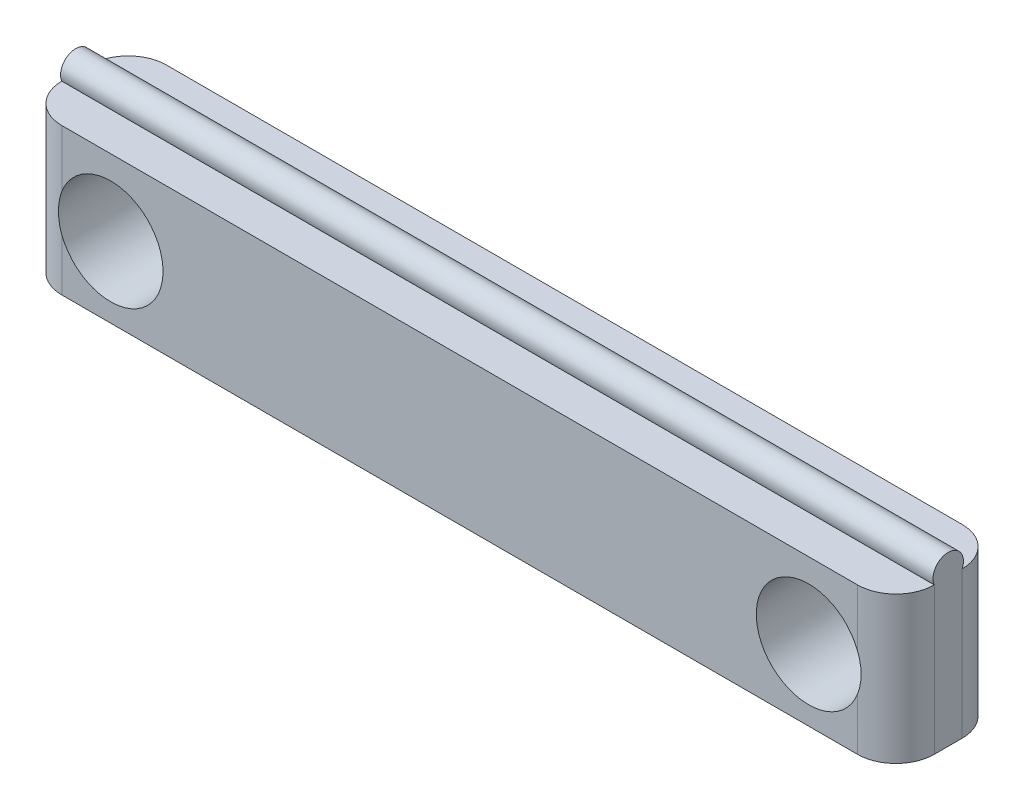
ISO-10303-21;
HEADER;
FILE_DESCRIPTION(('STEP AP214'),'2;1');
FILE_NAME('part.step','',(''),(''),'','','');
FILE_SCHEMA(('AUTOMOTIVE_DESIGN { 1 0 10303 214 1 1 1 1 }'));
ENDSEC;
DATA;
#1=APPLICATION_CONTEXT('core data for automotive mechanical design processes');
#2=APPLICATION_PROTOCOL_DEFINITION('international standard','automotive_design',2000,#1);
#3=PRODUCT_CONTEXT('',#1,'mechanical');
#4=PRODUCT('Part','Part','',(#3));
#5=PRODUCT_RELATED_PRODUCT_CATEGORY('part','',(#4));
#6=PRODUCT_DEFINITION_FORMATION('','',#4);
#7=PRODUCT_DEFINITION_CONTEXT('part definition',#1,'design');
#8=PRODUCT_DEFINITION('design','',#6,#7);
#9=PRODUCT_DEFINITION_SHAPE('','',#8);
#10=(LENGTH_UNIT() NAMED_UNIT(*) SI_UNIT(.MILLI.,.METRE.));
#11=(NAMED_UNIT(*) PLANE_ANGLE_UNIT() SI_UNIT($,.RADIAN.));
#12=(NAMED_UNIT(*) SI_UNIT($,.STERADIAN.) SOLID_ANGLE_UNIT());
#13=UNCERTAINTY_MEASURE_WITH_UNIT(LENGTH_MEASURE(1.E-05),#10,'distance_accuracy_value','');
#14=(GEOMETRIC_REPRESENTATION_CONTEXT(3) GLOBAL_UNCERTAINTY_ASSIGNED_CONTEXT((#13)) GLOBAL_UNIT_ASSIGNED_CONTEXT((#10,
#11,#12)) REPRESENTATION_CONTEXT('',''));
#15=CARTESIAN_POINT('',(0.,0.,0.));
#16=DIRECTION('',(0.,0.,1.));
#17=DIRECTION('',(1.,0.,0.));
#18=AXIS2_PLACEMENT_3D('',#15,#16,#17);
#19=CARTESIAN_POINT('',(-125.,108.700518049862,150.));
#20=DIRECTION('',(0.,-1.,0.));
#21=DIRECTION('',(0.,0.,-1.));
#22=AXIS2_PLACEMENT_3D('',#19,#20,#21);
#23=PLANE('',#22);
#24=CARTESIAN_POINT('',(1070.,108.700518049862,95.));
#25=DIRECTION('',(0.,-1.,0.));
#26=DIRECTION('',(0.,0.,-1.));
#27=AXIS2_PLACEMENT_3D('',#24,#25,#26);
#28=CIRCLE('',#27,55.);
#29=CARTESIAN_POINT('',(1070.,108.700518049862,150.));
#30=VERTEX_POINT('',#29);
#31=CARTESIAN_POINT('',(1125.,108.700518049862,95.));
#32=VERTEX_POINT('',#31);
#33=EDGE_CURVE('E158',#30,#32,#28,.F.);
#34=ORIENTED_EDGE('',*,*,#33,.T.);
#35=DIRECTION('',(-1.,0.,0.));
#36=VECTOR('',#35,1.);
#37=CARTESIAN_POINT('',(1125.,108.700518049862,95.));
#38=LINE('',#37,#36);
#39=CARTESIAN_POINT('',(-125.,108.700518049862,95.));
#40=VERTEX_POINT('',#39);
#41=EDGE_CURVE('E133',#32,#40,#38,.T.);
#42=ORIENTED_EDGE('',*,*,#41,.T.);
#43=CARTESIAN_POINT('',(-70.,108.700518049862,95.));
#44=DIRECTION('',(0.,-1.,0.));
#45=DIRECTION('',(0.,0.,-1.));
#46=AXIS2_PLACEMENT_3D('',#43,#44,#45);
#47=CIRCLE('',#46,55.);
#48=CARTESIAN_POINT('',(-70.,108.700518049862,150.));
#49=VERTEX_POINT('',#48);
#50=EDGE_CURVE('E166',#40,#49,#47,.F.);
#51=ORIENTED_EDGE('',*,*,#50,.T.);
#52=DIRECTION('',(-1.,0.,0.));
#53=VECTOR('',#52,1.);
#54=CARTESIAN_POINT('',(-125.,108.700518049862,150.));
#55=LINE('',#54,#53);
#56=EDGE_CURVE('E243',#30,#49,#55,.T.);
#57=ORIENTED_EDGE('',*,*,#56,.F.);
#58=EDGE_LOOP('',(#34,#42,#51,#57));
#59=FACE_BOUND('',#58,.T.);
#60=ADVANCED_FACE('F37',(#59),#23,.F.);
#61=CARTESIAN_POINT('',(-125.,108.700518049862,150.));
#62=DIRECTION('',(1.,0.,0.));
#63=DIRECTION('',(0.,0.,-1.));
#64=AXIS2_PLACEMENT_3D('',#61,#62,#63);
#65=PLANE('',#64);
#66=DIRECTION('',(0.,0.,-1.));
#67=VECTOR('',#66,1.);
#68=CARTESIAN_POINT('',(-125.,-101.556874760841,150.));
#69=LINE('',#68,#67);
#70=CARTESIAN_POINT('',(-125.,-101.556874760841,95.));
#71=VERTEX_POINT('',#70);
#72=CARTESIAN_POINT('',(-125.,-101.556874760841,55.));
#73=VERTEX_POINT('',#72);
#74=EDGE_CURVE('E168',#71,#73,#69,.T.);
#75=ORIENTED_EDGE('',*,*,#74,.F.);
#76=DIRECTION('',(0.,-1.,0.));
#77=VECTOR('',#76,1.);
#78=CARTESIAN_POINT('',(-125.,108.700518049862,95.));
#79=LINE('',#78,#77);
#80=EDGE_CURVE('E11',#71,#40,#79,.F.);
#81=ORIENTED_EDGE('',*,*,#80,.T.);
#82=CARTESIAN_POINT('',(-125.,117.351704167391,75.));
#83=DIRECTION('',(-1.,0.,0.));
#84=DIRECTION('',(0.,0.,-1.));
#85=AXIS2_PLACEMENT_3D('',#82,#83,#84);
#86=CIRCLE('',#85,21.7908930803702);
#87=CARTESIAN_POINT('',(-125.,108.700518049862,55.));
#88=VERTEX_POINT('',#87);
#89=EDGE_CURVE('E137',#40,#88,#86,.T.);
#90=ORIENTED_EDGE('',*,*,#89,.T.);
#91=DIRECTION('',(0.,-1.,0.));
#92=VECTOR('',#91,1.);
#93=CARTESIAN_POINT('',(-125.,108.700518049862,55.));
#94=LINE('',#93,#92);
#95=EDGE_CURVE('E46',#88,#73,#94,.T.);
#96=ORIENTED_EDGE('',*,*,#95,.T.);
#97=EDGE_LOOP('',(#75,#81,#90,#96));
#98=FACE_BOUND('',#97,.T.);
#99=ADVANCED_FACE('F222',(#98),#65,.F.);
#100=CARTESIAN_POINT('',(-125.,-101.556874760841,150.));
#101=DIRECTION('',(0.,1.,0.));
#102=DIRECTION('',(0.,0.,1.));
#103=AXIS2_PLACEMENT_3D('',#100,#101,#102);
#104=PLANE('',#103);
#105=DIRECTION('',(1.,0.,0.));
#106=VECTOR('',#105,1.);
#107=CARTESIAN_POINT('',(-125.,-101.556874760841,0.));
#108=LINE('',#107,#106);
#109=CARTESIAN_POINT('',(-70.,-101.556874760841,0.));
#110=VERTEX_POINT('',#109);
#111=CARTESIAN_POINT('',(1070.,-101.556874760841,0.));
#112=VERTEX_POINT('',#111);
#113=EDGE_CURVE('E259',#110,#112,#108,.T.);
#114=ORIENTED_EDGE('',*,*,#113,.T.);
#115=CARTESIAN_POINT('',(1070.,-101.556874760841,55.));
#116=DIRECTION('',(0.,1.,0.));
#117=DIRECTION('',(0.,0.,1.));
#118=AXIS2_PLACEMENT_3D('',#115,#116,#117);
#119=CIRCLE('',#118,55.);
#120=CARTESIAN_POINT('',(1125.,-101.556874760841,55.));
#121=VERTEX_POINT('',#120);
#122=EDGE_CURVE('E251',#112,#121,#119,.F.);
#123=ORIENTED_EDGE('',*,*,#122,.T.);
#124=DIRECTION('',(0.,0.,-1.));
#125=VECTOR('',#124,1.);
#126=CARTESIAN_POINT('',(1125.,-101.556874760841,150.));
#127=LINE('',#126,#125);
#128=CARTESIAN_POINT('',(1125.,-101.556874760841,95.));
#129=VERTEX_POINT('',#128);
#130=EDGE_CURVE('E163',#129,#121,#127,.T.);
#131=ORIENTED_EDGE('',*,*,#130,.F.);
#132=CARTESIAN_POINT('',(1070.,-101.556874760841,95.));
#133=DIRECTION('',(0.,1.,0.));
#134=DIRECTION('',(0.,0.,1.));
#135=AXIS2_PLACEMENT_3D('',#132,#133,#134);
#136=CIRCLE('',#135,55.);
#137=CARTESIAN_POINT('',(1070.,-101.556874760841,150.));
#138=VERTEX_POINT('',#137);
#139=EDGE_CURVE('E247',#129,#138,#136,.F.);
#140=ORIENTED_EDGE('',*,*,#139,.T.);
#141=DIRECTION('',(1.,0.,0.));
#142=VECTOR('',#141,1.);
#143=CARTESIAN_POINT('',(-125.,-101.556874760841,150.));
#144=LINE('',#143,#142);
#145=CARTESIAN_POINT('',(-70.,-101.556874760841,150.));
#146=VERTEX_POINT('',#145);
#147=EDGE_CURVE('E254',#146,#138,#144,.T.);
#148=ORIENTED_EDGE('',*,*,#147,.F.);
#149=CARTESIAN_POINT('',(-70.,-101.556874760841,95.));
#150=DIRECTION('',(0.,1.,0.));
#151=DIRECTION('',(0.,0.,1.));
#152=AXIS2_PLACEMENT_3D('',#149,#150,#151);
#153=CIRCLE('',#152,55.);
#154=EDGE_CURVE('E317',#146,#71,#153,.F.);
#155=ORIENTED_EDGE('',*,*,#154,.T.);
#156=ORIENTED_EDGE('',*,*,#74,.T.);
#157=CARTESIAN_POINT('',(-70.,-101.556874760841,55.));
#158=DIRECTION('',(0.,1.,0.));
#159=DIRECTION('',(0.,0.,1.));
#160=AXIS2_PLACEMENT_3D('',#157,#158,#159);
#161=CIRCLE('',#160,55.);
#162=EDGE_CURVE('E315',#73,#110,#161,.F.);
#163=ORIENTED_EDGE('',*,*,#162,.T.);
#164=EDGE_LOOP('',(#114,#123,#131,#140,#148,#155,#156,#163));
#165=FACE_BOUND('',#164,.T.);
#166=ADVANCED_FACE('F219',(#165),#104,.F.);
#167=CARTESIAN_POINT('',(1125.,108.700518049862,150.));
#168=DIRECTION('',(-1.,0.,0.));
#169=DIRECTION('',(0.,0.,1.));
#170=AXIS2_PLACEMENT_3D('',#167,#168,#169);
#171=PLANE('',#170);
#172=ORIENTED_EDGE('',*,*,#130,.T.);
#173=DIRECTION('',(0.,1.,0.));
#174=VECTOR('',#173,1.);
#175=CARTESIAN_POINT('',(1125.,108.700518049862,55.));
#176=LINE('',#175,#174);
#177=CARTESIAN_POINT('',(1125.,108.700518049862,55.));
#178=VERTEX_POINT('',#177);
#179=EDGE_CURVE('E155',#121,#178,#176,.T.);
#180=ORIENTED_EDGE('',*,*,#179,.T.);
#181=CARTESIAN_POINT('',(1125.,117.351704167391,75.));
#182=DIRECTION('',(-1.,0.,0.));
#183=DIRECTION('',(0.,0.,-1.));
#184=AXIS2_PLACEMENT_3D('',#181,#182,#183);
#185=CIRCLE('',#184,21.7908930803702);
#186=EDGE_CURVE('E127',#32,#178,#185,.T.);
#187=ORIENTED_EDGE('',*,*,#186,.F.);
#188=DIRECTION('',(0.,1.,0.));
#189=VECTOR('',#188,1.);
#190=CARTESIAN_POINT('',(1125.,-101.556874760841,95.));
#191=LINE('',#190,#189);
#192=EDGE_CURVE('E164',#32,#129,#191,.F.);
#193=ORIENTED_EDGE('',*,*,#192,.T.);
#194=EDGE_LOOP('',(#172,#180,#187,#193));
#195=FACE_BOUND('',#194,.T.);
#196=ADVANCED_FACE('F161',(#195),#171,.F.);
#197=CARTESIAN_POINT('',(-70.,108.700518049862,55.));
#198=DIRECTION('',(0.,-1.,0.));
#199=DIRECTION('',(0.,0.,-1.));
#200=AXIS2_PLACEMENT_3D('',#197,#198,#199);
#201=CIRCLE('',#200,55.);
#202=CARTESIAN_POINT('',(-70.,108.700518049862,0.));
#203=VERTEX_POINT('',#202);
#204=EDGE_CURVE('E146',#203,#88,#201,.F.);
#205=ORIENTED_EDGE('',*,*,#204,.T.);
#206=DIRECTION('',(-1.,0.,0.));
#207=VECTOR('',#206,1.);
#208=CARTESIAN_POINT('',(1125.,108.700518049862,55.));
#209=LINE('',#208,#207);
#210=EDGE_CURVE('E130',#178,#88,#209,.T.);
#211=ORIENTED_EDGE('',*,*,#210,.F.);
#212=CARTESIAN_POINT('',(1070.,108.700518049862,55.));
#213=DIRECTION('',(0.,-1.,0.));
#214=DIRECTION('',(0.,0.,-1.));
#215=AXIS2_PLACEMENT_3D('',#212,#213,#214);
#216=CIRCLE('',#215,55.);
#217=CARTESIAN_POINT('',(1070.,108.700518049862,0.));
#218=VERTEX_POINT('',#217);
#219=EDGE_CURVE('E143',#178,#218,#216,.F.);
#220=ORIENTED_EDGE('',*,*,#219,.T.);
#221=DIRECTION('',(-1.,0.,0.));
#222=VECTOR('',#221,1.);
#223=CARTESIAN_POINT('',(-125.,108.700518049862,0.));
#224=LINE('',#223,#222);
#225=EDGE_CURVE('E257',#218,#203,#224,.T.);
#226=ORIENTED_EDGE('',*,*,#225,.T.);
#227=EDGE_LOOP('',(#205,#211,#220,#226));
#228=FACE_BOUND('',#227,.T.);
#229=ADVANCED_FACE('F141',(#228),#23,.F.);
#230=CARTESIAN_POINT('',(0.,0.,150.));
#231=DIRECTION('',(0.,0.,1.));
#232=DIRECTION('',(1.,0.,0.));
#233=AXIS2_PLACEMENT_3D('',#230,#231,#232);
#234=PLANE('',#233);
#235=ORIENTED_EDGE('',*,*,#147,.T.);
#236=DIRECTION('',(0.,1.,0.));
#237=VECTOR('',#236,1.);
#238=CARTESIAN_POINT('',(1070.,108.700518049862,150.));
#239=LINE('',#238,#237);
#240=CARTESIAN_POINT('',(1070.,-26.9258240356724,150.));
#241=VERTEX_POINT('',#240);
#242=EDGE_CURVE('E283',#138,#241,#239,.T.);
#243=ORIENTED_EDGE('',*,*,#242,.T.);
#244=CARTESIAN_POINT('',(1000.,0.,150.));
#245=DIRECTION('',(0.,0.,1.));
#246=DIRECTION('',(1.,0.,0.));
#247=AXIS2_PLACEMENT_3D('',#244,#245,#246);
#248=CIRCLE('',#247,75.);
#249=CARTESIAN_POINT('',(1070.,26.9258240356724,150.));
#250=VERTEX_POINT('',#249);
#251=EDGE_CURVE('E266',#250,#241,#248,.T.);
#252=ORIENTED_EDGE('',*,*,#251,.F.);
#253=DIRECTION('',(0.,1.,0.));
#254=VECTOR('',#253,1.);
#255=CARTESIAN_POINT('',(1070.,108.700518049862,150.));
#256=LINE('',#255,#254);
#257=EDGE_CURVE('E281',#250,#30,#256,.T.);
#258=ORIENTED_EDGE('',*,*,#257,.T.);
#259=ORIENTED_EDGE('',*,*,#56,.T.);
#260=DIRECTION('',(0.,-1.,0.));
#261=VECTOR('',#260,1.);
#262=CARTESIAN_POINT('',(-70.,-101.556874760841,150.));
#263=LINE('',#262,#261);
#264=CARTESIAN_POINT('',(-70.,26.9258240356725,150.));
#265=VERTEX_POINT('',#264);
#266=EDGE_CURVE('E279',#49,#265,#263,.T.);
#267=ORIENTED_EDGE('',*,*,#266,.T.);
#268=CARTESIAN_POINT('',(0.,0.,150.));
#269=DIRECTION('',(0.,0.,1.));
#270=DIRECTION('',(1.,0.,0.));
#271=AXIS2_PLACEMENT_3D('',#268,#269,#270);
#272=CIRCLE('',#271,75.);
#273=CARTESIAN_POINT('',(-70.,-26.9258240356725,150.));
#274=VERTEX_POINT('',#273);
#275=EDGE_CURVE('E269',#274,#265,#272,.T.);
#276=ORIENTED_EDGE('',*,*,#275,.F.);
#277=DIRECTION('',(0.,-1.,0.));
#278=VECTOR('',#277,1.);
#279=CARTESIAN_POINT('',(-70.,-101.556874760841,150.));
#280=LINE('',#279,#278);
#281=EDGE_CURVE('E287',#274,#146,#280,.T.);
#282=ORIENTED_EDGE('',*,*,#281,.T.);
#283=EDGE_LOOP('',(#235,#243,#252,#258,#259,#267,#276,#282));
#284=FACE_BOUND('',#283,.T.);
#285=ADVANCED_FACE('F207',(#284),#234,.T.);
#286=CARTESIAN_POINT('',(0.,0.,0.));
#287=DIRECTION('',(0.,0.,1.));
#288=DIRECTION('',(1.,0.,0.));
#289=AXIS2_PLACEMENT_3D('',#286,#287,#288);
#290=PLANE('',#289);
#291=ORIENTED_EDGE('',*,*,#225,.F.);
#292=DIRECTION('',(0.,1.,0.));
#293=VECTOR('',#292,1.);
#294=CARTESIAN_POINT('',(1070.,0.,0.));
#295=LINE('',#294,#293);
#296=CARTESIAN_POINT('',(1070.,26.9258240356724,0.));
#297=VERTEX_POINT('',#296);
#298=EDGE_CURVE('E156',#218,#297,#295,.F.);
#299=ORIENTED_EDGE('',*,*,#298,.T.);
#300=CARTESIAN_POINT('',(1000.,0.,0.));
#301=DIRECTION('',(0.,0.,1.));
#302=DIRECTION('',(1.,0.,0.));
#303=AXIS2_PLACEMENT_3D('',#300,#301,#302);
#304=CIRCLE('',#303,75.);
#305=CARTESIAN_POINT('',(1070.,-26.9258240356724,0.));
#306=VERTEX_POINT('',#305);
#307=EDGE_CURVE('E263',#297,#306,#304,.T.);
#308=ORIENTED_EDGE('',*,*,#307,.T.);
#309=DIRECTION('',(0.,1.,0.));
#310=VECTOR('',#309,1.);
#311=CARTESIAN_POINT('',(1070.,0.,0.));
#312=LINE('',#311,#310);
#313=EDGE_CURVE('E177',#306,#112,#312,.F.);
#314=ORIENTED_EDGE('',*,*,#313,.T.);
#315=ORIENTED_EDGE('',*,*,#113,.F.);
#316=DIRECTION('',(0.,-1.,0.));
#317=VECTOR('',#316,1.);
#318=CARTESIAN_POINT('',(-70.,0.,0.));
#319=LINE('',#318,#317);
#320=CARTESIAN_POINT('',(-70.,-26.9258240356725,0.));
#321=VERTEX_POINT('',#320);
#322=EDGE_CURVE('E175',#110,#321,#319,.F.);
#323=ORIENTED_EDGE('',*,*,#322,.T.);
#324=CARTESIAN_POINT('',(0.,0.,0.));
#325=DIRECTION('',(0.,0.,1.));
#326=DIRECTION('',(1.,0.,0.));
#327=AXIS2_PLACEMENT_3D('',#324,#325,#326);
#328=CIRCLE('',#327,75.);
#329=CARTESIAN_POINT('',(-70.,26.9258240356725,0.));
#330=VERTEX_POINT('',#329);
#331=EDGE_CURVE('E260',#321,#330,#328,.T.);
#332=ORIENTED_EDGE('',*,*,#331,.T.);
#333=DIRECTION('',(0.,-1.,0.));
#334=VECTOR('',#333,1.);
#335=CARTESIAN_POINT('',(-70.,0.,0.));
#336=LINE('',#335,#334);
#337=EDGE_CURVE('E157',#330,#203,#336,.F.);
#338=ORIENTED_EDGE('',*,*,#337,.T.);
#339=EDGE_LOOP('',(#291,#299,#308,#314,#315,#323,#332,#338));
#340=FACE_BOUND('',#339,.T.);
#341=ADVANCED_FACE('F203',(#340),#290,.F.);
#342=CARTESIAN_POINT('',(1000.,0.,0.));
#343=DIRECTION('',(0.,0.,1.));
#344=DIRECTION('',(1.,0.,0.));
#345=AXIS2_PLACEMENT_3D('',#342,#343,#344);
#346=CYLINDRICAL_SURFACE('',#345,75.);
#347=ORIENTED_EDGE('',*,*,#307,.F.);
#348=CARTESIAN_POINT('',(1070.,26.9258240356724,0.));
#349=CARTESIAN_POINT('',(1070.21419455052,26.3689749335106,3.35340921403298E-06));
#350=CARTESIAN_POINT('',(1070.42173523753,25.8095932602511,0.00125081391135483));
#351=CARTESIAN_POINT('',(1070.82340582313,24.6860513712617,0.0057965766707964));
#352=CARTESIAN_POINT('',(1071.01753588746,24.1218912146853,0.00909485357731887));
#353=CARTESIAN_POINT('',(1071.57963405792,22.4227404227415,0.0214092811714174));
#354=CARTESIAN_POINT('',(1071.92734354958,21.2809926069426,0.0328451655754263));
#355=CARTESIAN_POINT('',(1072.5678641116,18.9823277100107,0.0590427221504257));
#356=CARTESIAN_POINT('',(1072.86067666631,17.8254110399272,0.0738043043754658));
#357=CARTESIAN_POINT('',(1073.39077958053,15.4989275983854,0.10397893227852));
#358=CARTESIAN_POINT('',(1073.62807037757,14.3293609266895,0.119391972821676));
#359=CARTESIAN_POINT('',(1074.03961862062,12.0193620356505,0.148176193445005));
#360=CARTESIAN_POINT('',(1074.21571246163,10.879257090428,0.161598287156531));
#361=CARTESIAN_POINT('',(1074.51513811221,8.59210874718533,0.185438924465029));
#362=CARTESIAN_POINT('',(1074.63847019465,7.44506538507806,0.195857483594612));
#363=CARTESIAN_POINT('',(1074.83209248075,5.14663400454717,0.212589727829469));
#364=CARTESIAN_POINT('',(1074.90238966432,3.99524657789719,0.218903953089672));
#365=CARTESIAN_POINT('',(1074.9898147285,1.69044267330444,0.226797672755843));
#366=CARTESIAN_POINT('',(1075.00694302006,0.537026211113926,0.228377203758323));
#367=CARTESIAN_POINT('',(1074.98840219682,-1.71976423854628,0.226686452277081));
#368=CARTESIAN_POINT('',(1074.95497166131,-2.82315742269802,0.2236217876423));
#369=CARTESIAN_POINT('',(1074.83945180795,-5.02736469456513,0.21329469922422));
#370=CARTESIAN_POINT('',(1074.75736302586,-6.1281788105446,0.206032321661893));
#371=CARTESIAN_POINT('',(1074.5446853554,-8.32513738895036,0.187982915133257));
#372=CARTESIAN_POINT('',(1074.41409404361,-9.42128161528021,0.177195710054486));
#373=CARTESIAN_POINT('',(1074.10467056745,-11.6067130205202,0.153161044835557));
#374=CARTESIAN_POINT('',(1073.92583820979,-12.6960001719381,0.139913574837873));
#375=CARTESIAN_POINT('',(1073.51359062253,-14.901393676684,0.111943183693296));
#376=CARTESIAN_POINT('',(1073.27856994725,-16.017199925649,0.0971860137821064));
#377=CARTESIAN_POINT('',(1072.75791091819,-18.2369422536474,0.0685711528667047));
#378=CARTESIAN_POINT('',(1072.47227232017,-19.3408782753765,0.0547134662031948));
#379=CARTESIAN_POINT('',(1071.85091429909,-21.534759995464,0.0302736490256255));
#380=CARTESIAN_POINT('',(1071.51519033202,-22.6247044146776,0.0196918159820654));
#381=CARTESIAN_POINT('',(1070.97461626443,-24.2472462602949,0.00834128705558364));
#382=CARTESIAN_POINT('',(1070.78825268367,-24.7860506782281,0.00531145257693193));
#383=CARTESIAN_POINT('',(1070.40328464943,-25.8592826261889,0.00114219681778567));
#384=CARTESIAN_POINT('',(1070.20468005877,-26.3937101070914,2.79672596233901E-06));
#385=CARTESIAN_POINT('',(1070.,-26.9258240356724,0.));
#386=B_SPLINE_CURVE_WITH_KNOTS('',3,(#348,#349,#350,#351,#352,#353,#354,#355,#356,#357,#358,
#359,#360,#361,#362,#363,#364,#365,#366,#367,#368,#369,#370,#371,#372,#373,#374,#375,#376,#377,
#378,#379,#380,#381,#382,#383,#384,#385),.UNSPECIFIED.,.F.,.F.,(4,2,2,2,2,2,2,2,2,2,2,2,2,2,2,2,
2,2,4),(0.,1.78977916281523,3.57953620205438,7.15877138823087,10.7379097829704,14.3170199718529,
17.7769068533395,21.2367758418937,24.6961893987196,28.1555762161648,31.4662120263058,
34.7768113837649,38.0875761754112,41.3983542325611,44.8183074377338,48.2382771455975,
51.6585573196787,53.3688232847113,55.0791084188928),.UNSPECIFIED.);
#387=EDGE_CURVE('E188',#297,#306,#386,.T.);
#388=ORIENTED_EDGE('',*,*,#387,.T.);
#389=EDGE_LOOP('',(#347,#388));
#390=FACE_BOUND('',#389,.T.);
#391=ORIENTED_EDGE('',*,*,#251,.T.);
#392=CARTESIAN_POINT('',(1070.,-26.9258240356724,150.));
#393=CARTESIAN_POINT('',(1070.21419455052,-26.3689749335106,149.999996646591));
#394=CARTESIAN_POINT('',(1070.42173523753,-25.8095932602511,149.998749186089));
#395=CARTESIAN_POINT('',(1070.82340582313,-24.6860513712617,149.994203423329));
#396=CARTESIAN_POINT('',(1071.01753588746,-24.1218912146853,149.990905146423));
#397=CARTESIAN_POINT('',(1071.57963405792,-22.4227404227415,149.978590718829));
#398=CARTESIAN_POINT('',(1071.92734354958,-21.2809926069426,149.967154834425));
#399=CARTESIAN_POINT('',(1072.5678641116,-18.9823277100107,149.94095727785));
#400=CARTESIAN_POINT('',(1072.86067666631,-17.8254110399272,149.926195695625));
#401=CARTESIAN_POINT('',(1073.39077958053,-15.4989275983854,149.896021067721));
#402=CARTESIAN_POINT('',(1073.62807037757,-14.3293609266895,149.880608027178));
#403=CARTESIAN_POINT('',(1074.03961862062,-12.0193620356505,149.851823806555));
#404=CARTESIAN_POINT('',(1074.21571246163,-10.879257090428,149.838401712843));
#405=CARTESIAN_POINT('',(1074.51513811221,-8.59210874718533,149.814561075535));
#406=CARTESIAN_POINT('',(1074.63847019465,-7.44506538507806,149.804142516405));
#407=CARTESIAN_POINT('',(1074.83209248075,-5.14663400454717,149.787410272171));
#408=CARTESIAN_POINT('',(1074.90238966432,-3.99524657789719,149.78109604691));
#409=CARTESIAN_POINT('',(1074.9898147285,-1.69044267330444,149.773202327244));
#410=CARTESIAN_POINT('',(1075.00694302006,-0.537026211113927,149.771622796242));
#411=CARTESIAN_POINT('',(1074.98840219682,1.71976423854628,149.773313547723));
#412=CARTESIAN_POINT('',(1074.95497166131,2.82315742269802,149.776378212358));
#413=CARTESIAN_POINT('',(1074.83945180795,5.02736469456513,149.786705300776));
#414=CARTESIAN_POINT('',(1074.75736302586,6.1281788105446,149.793967678338));
#415=CARTESIAN_POINT('',(1074.5446853554,8.32513738895036,149.812017084867));
#416=CARTESIAN_POINT('',(1074.41409404361,9.42128161528021,149.822804289946));
#417=CARTESIAN_POINT('',(1074.10467056745,11.6067130205202,149.846838955164));
#418=CARTESIAN_POINT('',(1073.92583820979,12.6960001719381,149.860086425162));
#419=CARTESIAN_POINT('',(1073.51359062253,14.901393676684,149.888056816307));
#420=CARTESIAN_POINT('',(1073.27856994725,16.017199925649,149.902813986218));
#421=CARTESIAN_POINT('',(1072.75791091819,18.2369422536474,149.931428847133));
#422=CARTESIAN_POINT('',(1072.47227232017,19.3408782753765,149.945286533797));
#423=CARTESIAN_POINT('',(1071.85091429909,21.534759995464,149.969726350974));
#424=CARTESIAN_POINT('',(1071.51519033202,22.6247044146776,149.980308184018));
#425=CARTESIAN_POINT('',(1070.97461626443,24.2472462602949,149.991658712944));
#426=CARTESIAN_POINT('',(1070.78825268367,24.7860506782281,149.994688547423));
#427=CARTESIAN_POINT('',(1070.40328464943,25.8592826261889,149.998857803182));
#428=CARTESIAN_POINT('',(1070.20468005877,26.3937101070914,149.999997203274));
#429=CARTESIAN_POINT('',(1070.,26.9258240356724,150.));
#430=B_SPLINE_CURVE_WITH_KNOTS('',3,(#392,#393,#394,#395,#396,#397,#398,#399,#400,#401,#402,
#403,#404,#405,#406,#407,#408,#409,#410,#411,#412,#413,#414,#415,#416,#417,#418,#419,#420,#421,
#422,#423,#424,#425,#426,#427,#428,#429),.UNSPECIFIED.,.F.,.F.,(4,2,2,2,2,2,2,2,2,2,2,2,2,2,2,2,
2,2,4),(0.,1.78977916281523,3.57953620205438,7.15877138823087,10.7379097829704,14.3170199718529,
17.7769068533395,21.2367758418937,24.6961893987196,28.1555762161648,31.4662120263058,
34.7768113837649,38.0875761754112,41.3983542325611,44.8183074377338,48.2382771455975,
51.6585573196787,53.3688232847112,55.0791084188928),.UNSPECIFIED.);
#431=EDGE_CURVE('E180',#241,#250,#430,.T.);
#432=ORIENTED_EDGE('',*,*,#431,.T.);
#433=EDGE_LOOP('',(#391,#432));
#434=FACE_BOUND('',#433,.T.);
#435=ADVANCED_FACE('F197',(#390,#434),#346,.F.);
#436=CARTESIAN_POINT('',(0.,0.,0.));
#437=DIRECTION('',(0.,0.,1.));
#438=DIRECTION('',(1.,0.,0.));
#439=AXIS2_PLACEMENT_3D('',#436,#437,#438);
#440=CYLINDRICAL_SURFACE('',#439,75.);
#441=ORIENTED_EDGE('',*,*,#331,.F.);
#442=CARTESIAN_POINT('',(-70.,-26.9258240356725,0.));
#443=CARTESIAN_POINT('',(-70.2141945505167,-26.3689749335108,3.35340921321898E-06));
#444=CARTESIAN_POINT('',(-70.4217352375326,-25.8095932602512,0.00125081391135346));
#445=CARTESIAN_POINT('',(-70.823405823133,-24.6860513712619,0.00579657667079437));
#446=CARTESIAN_POINT('',(-71.0175358874574,-24.1218912146854,0.00909485357731673));
#447=CARTESIAN_POINT('',(-71.5796340579237,-22.4227404227416,0.021409281171416));
#448=CARTESIAN_POINT('',(-71.927343549575,-21.2809926069427,0.0328451655754268));
#449=CARTESIAN_POINT('',(-72.5678641115999,-18.9823277100107,0.0590427221504299));
#450=CARTESIAN_POINT('',(-72.8606766663094,-17.8254110399273,0.0738043043754719));
#451=CARTESIAN_POINT('',(-73.3907795805279,-15.4989275983854,0.103978932278525));
#452=CARTESIAN_POINT('',(-73.6280703775685,-14.3293609266896,0.119391972821679));
#453=CARTESIAN_POINT('',(-74.0396186206207,-12.0193620356506,0.148176193445007));
#454=CARTESIAN_POINT('',(-74.2157124616272,-10.8792570904281,0.161598287156534));
#455=CARTESIAN_POINT('',(-74.5151381122136,-8.59210874718542,0.185438924465034));
#456=CARTESIAN_POINT('',(-74.6384701946496,-7.44506538507815,0.195857483594617));
#457=CARTESIAN_POINT('',(-74.8320924807516,-5.14663400454728,0.21258972782947));
#458=CARTESIAN_POINT('',(-74.9023896643239,-3.9952465778973,0.218903953089668));
#459=CARTESIAN_POINT('',(-74.989814728497,-1.69044267330457,0.226797672755839));
#460=CARTESIAN_POINT('',(-75.0069430200633,-0.537026211114059,0.228377203758324));
#461=CARTESIAN_POINT('',(-74.988402196817,1.71976423854615,0.226686452277084));
#462=CARTESIAN_POINT('',(-74.9549716613098,2.8231574226979,0.223621787642301));
#463=CARTESIAN_POINT('',(-74.8394518079462,5.02736469456503,0.213294699224225));
#464=CARTESIAN_POINT('',(-74.7573630258649,6.12817881054451,0.206032321661904));
#465=CARTESIAN_POINT('',(-74.5446853553969,8.32513738895029,0.187982915133267));
#466=CARTESIAN_POINT('',(-74.4140940436129,9.42128161528016,0.17719571005449));
#467=CARTESIAN_POINT('',(-74.1046705674521,11.6067130205202,0.153161044835556));
#468=CARTESIAN_POINT('',(-73.9258382097868,12.6960001719381,0.139913574837874));
#469=CARTESIAN_POINT('',(-73.5135906225333,14.901393676684,0.1119431836933));
#470=CARTESIAN_POINT('',(-73.2785699472488,16.0171999256489,0.0971860137821096));
#471=CARTESIAN_POINT('',(-72.7579109181888,18.2369422536474,0.0685711528667112));
#472=CARTESIAN_POINT('',(-72.4722723201674,19.3408782753766,0.0547134662032048));
#473=CARTESIAN_POINT('',(-71.8509142990857,21.5347599954641,0.0302736490256263));
#474=CARTESIAN_POINT('',(-71.5151903320219,22.6247044146778,0.0196918159820533));
#475=CARTESIAN_POINT('',(-70.9746162644293,24.247246260295,0.00834128705557993));
#476=CARTESIAN_POINT('',(-70.7882526836703,24.7860506782282,0.00531145257693559));
#477=CARTESIAN_POINT('',(-70.4032846494291,25.859282626189,0.00114219681779773));
#478=CARTESIAN_POINT('',(-70.2046800587711,26.3937101070916,2.79672597531705E-06));
#479=CARTESIAN_POINT('',(-70.,26.9258240356725,0.));
#480=B_SPLINE_CURVE_WITH_KNOTS('',3,(#442,#443,#444,#445,#446,#447,#448,#449,#450,#451,#452,
#453,#454,#455,#456,#457,#458,#459,#460,#461,#462,#463,#464,#465,#466,#467,#468,#469,#470,#471,
#472,#473,#474,#475,#476,#477,#478,#479),.UNSPECIFIED.,.F.,.F.,(4,2,2,2,2,2,2,2,2,2,2,2,2,2,2,2,
2,2,4),(0.,1.78977916281522,3.57953620205433,7.15877138823094,10.7379097829705,14.3170199718529,
17.7769068533396,21.2367758418938,24.6961893987196,28.1555762161648,31.4662120263058,
34.776811383765,38.0875761754113,41.3983542325613,44.818307437734,48.2382771455977,
51.658557319679,53.3688232847116,55.0791084188931),.UNSPECIFIED.);
#481=EDGE_CURVE('E285',#321,#330,#480,.T.);
#482=ORIENTED_EDGE('',*,*,#481,.T.);
#483=EDGE_LOOP('',(#441,#482));
#484=FACE_BOUND('',#483,.T.);
#485=ORIENTED_EDGE('',*,*,#275,.T.);
#486=CARTESIAN_POINT('',(-70.,26.9258240356725,150.));
#487=CARTESIAN_POINT('',(-70.2141945505167,26.3689749335108,149.999996646591));
#488=CARTESIAN_POINT('',(-70.4217352375326,25.8095932602512,149.998749186089));
#489=CARTESIAN_POINT('',(-70.823405823133,24.6860513712619,149.994203423329));
#490=CARTESIAN_POINT('',(-71.0175358874574,24.1218912146854,149.990905146423));
#491=CARTESIAN_POINT('',(-71.5796340579237,22.4227404227416,149.978590718829));
#492=CARTESIAN_POINT('',(-71.927343549575,21.2809926069427,149.967154834425));
#493=CARTESIAN_POINT('',(-72.5678641115999,18.9823277100107,149.94095727785));
#494=CARTESIAN_POINT('',(-72.8606766663094,17.8254110399273,149.926195695625));
#495=CARTESIAN_POINT('',(-73.3907795805279,15.4989275983854,149.896021067721));
#496=CARTESIAN_POINT('',(-73.6280703775685,14.3293609266896,149.880608027178));
#497=CARTESIAN_POINT('',(-74.0396186206207,12.0193620356506,149.851823806555));
#498=CARTESIAN_POINT('',(-74.2157124616272,10.8792570904281,149.838401712843));
#499=CARTESIAN_POINT('',(-74.5151381122136,8.59210874718542,149.814561075535));
#500=CARTESIAN_POINT('',(-74.6384701946496,7.44506538507815,149.804142516405));
#501=CARTESIAN_POINT('',(-74.8320924807516,5.14663400454728,149.787410272171));
#502=CARTESIAN_POINT('',(-74.9023896643239,3.9952465778973,149.78109604691));
#503=CARTESIAN_POINT('',(-74.989814728497,1.69044267330457,149.773202327244));
#504=CARTESIAN_POINT('',(-75.0069430200633,0.537026211114059,149.771622796242));
#505=CARTESIAN_POINT('',(-74.988402196817,-1.71976423854615,149.773313547723));
#506=CARTESIAN_POINT('',(-74.9549716613098,-2.8231574226979,149.776378212358));
#507=CARTESIAN_POINT('',(-74.8394518079462,-5.02736469456503,149.786705300776));
#508=CARTESIAN_POINT('',(-74.7573630258649,-6.12817881054451,149.793967678338));
#509=CARTESIAN_POINT('',(-74.5446853553969,-8.32513738895029,149.812017084867));
#510=CARTESIAN_POINT('',(-74.4140940436129,-9.42128161528016,149.822804289945));
#511=CARTESIAN_POINT('',(-74.1046705674521,-11.6067130205202,149.846838955164));
#512=CARTESIAN_POINT('',(-73.9258382097868,-12.6960001719381,149.860086425162));
#513=CARTESIAN_POINT('',(-73.5135906225333,-14.901393676684,149.888056816307));
#514=CARTESIAN_POINT('',(-73.2785699472488,-16.0171999256489,149.902813986218));
#515=CARTESIAN_POINT('',(-72.7579109181888,-18.2369422536474,149.931428847133));
#516=CARTESIAN_POINT('',(-72.4722723201674,-19.3408782753766,149.945286533797));
#517=CARTESIAN_POINT('',(-71.8509142990857,-21.5347599954641,149.969726350974));
#518=CARTESIAN_POINT('',(-71.5151903320219,-22.6247044146778,149.980308184018));
#519=CARTESIAN_POINT('',(-70.9746162644293,-24.247246260295,149.991658712944));
#520=CARTESIAN_POINT('',(-70.7882526836703,-24.7860506782282,149.994688547423));
#521=CARTESIAN_POINT('',(-70.4032846494291,-25.859282626189,149.998857803182));
#522=CARTESIAN_POINT('',(-70.2046800587711,-26.3937101070916,149.999997203274));
#523=CARTESIAN_POINT('',(-70.,-26.9258240356725,150.));
#524=B_SPLINE_CURVE_WITH_KNOTS('',3,(#486,#487,#488,#489,#490,#491,#492,#493,#494,#495,#496,
#497,#498,#499,#500,#501,#502,#503,#504,#505,#506,#507,#508,#509,#510,#511,#512,#513,#514,#515,
#516,#517,#518,#519,#520,#521,#522,#523),.UNSPECIFIED.,.F.,.F.,(4,2,2,2,2,2,2,2,2,2,2,2,2,2,2,2,
2,2,4),(0.,1.78977916281522,3.57953620205433,7.15877138823094,10.7379097829705,14.3170199718529,
17.7769068533396,21.2367758418938,24.6961893987196,28.1555762161648,31.4662120263058,
34.776811383765,38.0875761754113,41.3983542325613,44.818307437734,48.2382771455977,
51.658557319679,53.3688232847116,55.0791084188931),.UNSPECIFIED.);
#525=EDGE_CURVE('E52',#265,#274,#524,.T.);
#526=ORIENTED_EDGE('',*,*,#525,.T.);
#527=EDGE_LOOP('',(#485,#526));
#528=FACE_BOUND('',#527,.T.);
#529=ADVANCED_FACE('F202',(#484,#528),#440,.F.);
#530=CARTESIAN_POINT('',(1070.,108.700518049862,55.));
#531=DIRECTION('',(0.,1.,0.));
#532=DIRECTION('',(0.,0.,1.));
#533=AXIS2_PLACEMENT_3D('',#530,#531,#532);
#534=CYLINDRICAL_SURFACE('',#533,55.);
#535=ORIENTED_EDGE('',*,*,#387,.F.);
#536=ORIENTED_EDGE('',*,*,#298,.F.);
#537=ORIENTED_EDGE('',*,*,#219,.F.);
#538=ORIENTED_EDGE('',*,*,#179,.F.);
#539=ORIENTED_EDGE('',*,*,#122,.F.);
#540=ORIENTED_EDGE('',*,*,#313,.F.);
#541=EDGE_LOOP('',(#535,#536,#537,#538,#539,#540));
#542=FACE_BOUND('',#541,.T.);
#543=ADVANCED_FACE('F153',(#542),#534,.T.);
#544=CARTESIAN_POINT('',(1070.,0.,95.));
#545=DIRECTION('',(0.,-1.,0.));
#546=DIRECTION('',(0.,0.,-1.));
#547=AXIS2_PLACEMENT_3D('',#544,#545,#546);
#548=CYLINDRICAL_SURFACE('',#547,55.);
#549=ORIENTED_EDGE('',*,*,#139,.F.);
#550=ORIENTED_EDGE('',*,*,#192,.F.);
#551=ORIENTED_EDGE('',*,*,#33,.F.);
#552=ORIENTED_EDGE('',*,*,#257,.F.);
#553=ORIENTED_EDGE('',*,*,#431,.F.);
#554=ORIENTED_EDGE('',*,*,#242,.F.);
#555=EDGE_LOOP('',(#549,#550,#551,#552,#553,#554));
#556=FACE_BOUND('',#555,.T.);
#557=ADVANCED_FACE('F195',(#556),#548,.T.);
#558=CARTESIAN_POINT('',(-70.,0.,95.));
#559=DIRECTION('',(0.,1.,0.));
#560=DIRECTION('',(0.,0.,1.));
#561=AXIS2_PLACEMENT_3D('',#558,#559,#560);
#562=CYLINDRICAL_SURFACE('',#561,55.);
#563=ORIENTED_EDGE('',*,*,#50,.F.);
#564=ORIENTED_EDGE('',*,*,#80,.F.);
#565=ORIENTED_EDGE('',*,*,#154,.F.);
#566=ORIENTED_EDGE('',*,*,#281,.F.);
#567=ORIENTED_EDGE('',*,*,#525,.F.);
#568=ORIENTED_EDGE('',*,*,#266,.F.);
#569=EDGE_LOOP('',(#563,#564,#565,#566,#567,#568));
#570=FACE_BOUND('',#569,.T.);
#571=ADVANCED_FACE('F232',(#570),#562,.T.);
#572=CARTESIAN_POINT('',(-70.,108.700518049862,55.));
#573=DIRECTION('',(0.,-1.,0.));
#574=DIRECTION('',(0.,0.,-1.));
#575=AXIS2_PLACEMENT_3D('',#572,#573,#574);
#576=CYLINDRICAL_SURFACE('',#575,55.);
#577=ORIENTED_EDGE('',*,*,#481,.F.);
#578=ORIENTED_EDGE('',*,*,#322,.F.);
#579=ORIENTED_EDGE('',*,*,#162,.F.);
#580=ORIENTED_EDGE('',*,*,#95,.F.);
#581=ORIENTED_EDGE('',*,*,#204,.F.);
#582=ORIENTED_EDGE('',*,*,#337,.F.);
#583=EDGE_LOOP('',(#577,#578,#579,#580,#581,#582));
#584=FACE_BOUND('',#583,.T.);
#585=ADVANCED_FACE('F39',(#584),#576,.T.);
#586=CARTESIAN_POINT('',(1125.,117.351704167391,75.));
#587=DIRECTION('',(-1.,0.,0.));
#588=DIRECTION('',(0.,0.,1.));
#589=AXIS2_PLACEMENT_3D('',#586,#587,#588);
#590=CYLINDRICAL_SURFACE('',#589,21.7908930803702);
#591=ORIENTED_EDGE('',*,*,#89,.F.);
#592=ORIENTED_EDGE('',*,*,#41,.F.);
#593=ORIENTED_EDGE('',*,*,#186,.T.);
#594=ORIENTED_EDGE('',*,*,#210,.T.);
#595=EDGE_LOOP('',(#591,#592,#593,#594));
#596=FACE_BOUND('',#595,.T.);
#597=ADVANCED_FACE('F129',(#596),#590,.T.);
#598=CLOSED_SHELL('',(#60,#99,#166,#196,#229,#285,#341,#435,#529,#543,#557,#571,#585,#597));
#599=MANIFOLD_SOLID_BREP('B2',#598);
#600=ADVANCED_BREP_SHAPE_REPRESENTATION('',(#18,#599),#14);
#601=SHAPE_DEFINITION_REPRESENTATION(#9,#600);
ENDSEC;
END-ISO-10303-21;
